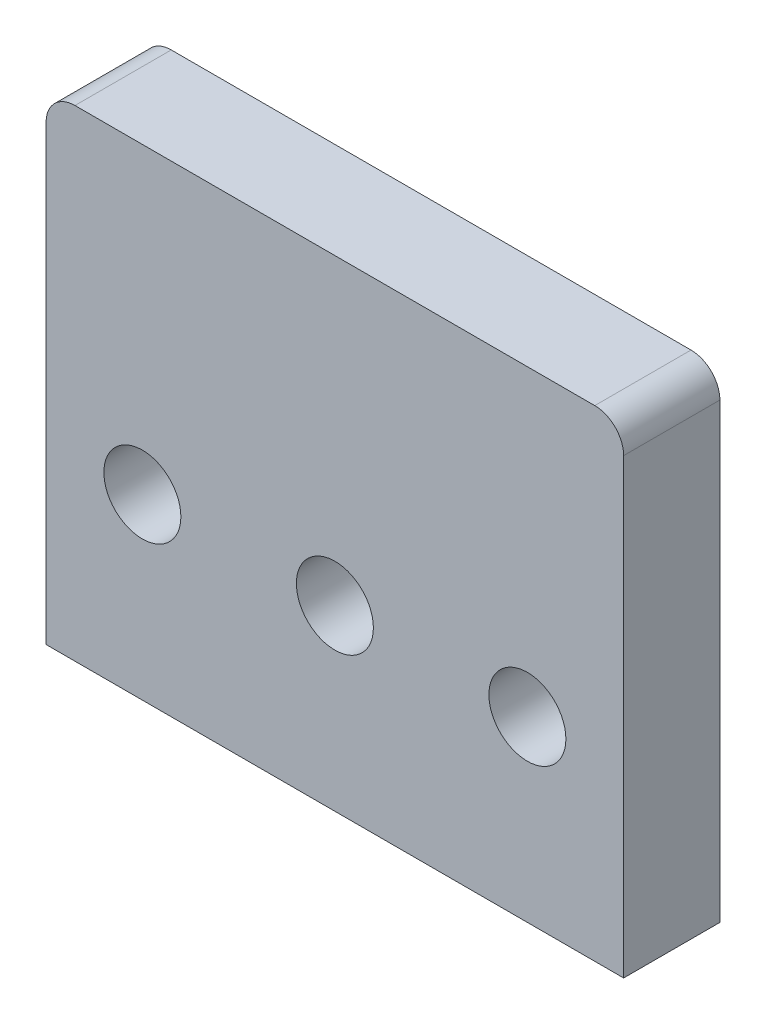
ISO-10303-21;
HEADER;
FILE_DESCRIPTION(('STEP AP214'),'2;1');
FILE_NAME('part.step','',(''),(''),'','','');
FILE_SCHEMA(('AUTOMOTIVE_DESIGN { 1 0 10303 214 1 1 1 1 }'));
ENDSEC;
DATA;
#1=APPLICATION_CONTEXT('core data for automotive mechanical design processes');
#2=APPLICATION_PROTOCOL_DEFINITION('international standard','automotive_design',2000,#1);
#3=PRODUCT_CONTEXT('',#1,'mechanical');
#4=PRODUCT('Part','Part','',(#3));
#5=PRODUCT_RELATED_PRODUCT_CATEGORY('part','',(#4));
#6=PRODUCT_DEFINITION_FORMATION('','',#4);
#7=PRODUCT_DEFINITION_CONTEXT('part definition',#1,'design');
#8=PRODUCT_DEFINITION('design','',#6,#7);
#9=PRODUCT_DEFINITION_SHAPE('','',#8);
#10=(LENGTH_UNIT() NAMED_UNIT(*) SI_UNIT(.MILLI.,.METRE.));
#11=(NAMED_UNIT(*) PLANE_ANGLE_UNIT() SI_UNIT($,.RADIAN.));
#12=(NAMED_UNIT(*) SI_UNIT($,.STERADIAN.) SOLID_ANGLE_UNIT());
#13=UNCERTAINTY_MEASURE_WITH_UNIT(LENGTH_MEASURE(1.E-05),#10,'distance_accuracy_value','');
#14=(GEOMETRIC_REPRESENTATION_CONTEXT(3) GLOBAL_UNCERTAINTY_ASSIGNED_CONTEXT((#13)) GLOBAL_UNIT_ASSIGNED_CONTEXT((#10,
#11,#12)) REPRESENTATION_CONTEXT('',''));
#15=CARTESIAN_POINT('',(0.,0.,0.));
#16=DIRECTION('',(0.,0.,1.));
#17=DIRECTION('',(1.,0.,0.));
#18=AXIS2_PLACEMENT_3D('',#15,#16,#17);
#19=CARTESIAN_POINT('',(-30.,-18.5,10.));
#20=DIRECTION('',(-1.,0.,0.));
#21=DIRECTION('',(0.,0.,1.));
#22=AXIS2_PLACEMENT_3D('',#19,#20,#21);
#23=PLANE('',#22);
#24=DIRECTION('',(0.,1.,0.));
#25=VECTOR('',#24,1.);
#26=CARTESIAN_POINT('',(-30.,-18.5,10.));
#27=LINE('',#26,#25);
#28=CARTESIAN_POINT('',(-30.,-18.5,10.));
#29=VERTEX_POINT('',#28);
#30=CARTESIAN_POINT('',(-30.,28.5,10.));
#31=VERTEX_POINT('',#30);
#32=EDGE_CURVE('E107',#29,#31,#27,.T.);
#33=ORIENTED_EDGE('',*,*,#32,.T.);
#34=DIRECTION('',(0.,0.,-1.));
#35=VECTOR('',#34,1.);
#36=CARTESIAN_POINT('',(-30.,28.5,10.));
#37=LINE('',#36,#35);
#38=CARTESIAN_POINT('',(-30.,28.5,0.));
#39=VERTEX_POINT('',#38);
#40=EDGE_CURVE('E118',#31,#39,#37,.T.);
#41=ORIENTED_EDGE('',*,*,#40,.T.);
#42=DIRECTION('',(0.,1.,0.));
#43=VECTOR('',#42,1.);
#44=CARTESIAN_POINT('',(-30.,-18.5,0.));
#45=LINE('',#44,#43);
#46=CARTESIAN_POINT('',(-30.,-18.5,0.));
#47=VERTEX_POINT('',#46);
#48=EDGE_CURVE('E137',#47,#39,#45,.T.);
#49=ORIENTED_EDGE('',*,*,#48,.F.);
#50=DIRECTION('',(0.,0.,-1.));
#51=VECTOR('',#50,1.);
#52=CARTESIAN_POINT('',(-30.,-18.5,10.));
#53=LINE('',#52,#51);
#54=EDGE_CURVE('E103',#29,#47,#53,.T.);
#55=ORIENTED_EDGE('',*,*,#54,.F.);
#56=EDGE_LOOP('',(#33,#41,#49,#55));
#57=FACE_BOUND('',#56,.T.);
#58=ADVANCED_FACE('F33',(#57),#23,.T.);
#59=CARTESIAN_POINT('',(-30.,-18.5,10.));
#60=DIRECTION('',(0.,1.,0.));
#61=DIRECTION('',(0.,0.,1.));
#62=AXIS2_PLACEMENT_3D('',#59,#60,#61);
#63=PLANE('',#62);
#64=DIRECTION('',(0.,0.,-1.));
#65=VECTOR('',#64,1.);
#66=CARTESIAN_POINT('',(30.,-18.5,10.));
#67=LINE('',#66,#65);
#68=CARTESIAN_POINT('',(30.,-18.5,10.));
#69=VERTEX_POINT('',#68);
#70=CARTESIAN_POINT('',(30.,-18.5,0.));
#71=VERTEX_POINT('',#70);
#72=EDGE_CURVE('E97',#69,#71,#67,.T.);
#73=ORIENTED_EDGE('',*,*,#72,.F.);
#74=DIRECTION('',(1.,0.,0.));
#75=VECTOR('',#74,1.);
#76=CARTESIAN_POINT('',(-30.,-18.5,10.));
#77=LINE('',#76,#75);
#78=EDGE_CURVE('E104',#29,#69,#77,.T.);
#79=ORIENTED_EDGE('',*,*,#78,.F.);
#80=ORIENTED_EDGE('',*,*,#54,.T.);
#81=DIRECTION('',(1.,0.,0.));
#82=VECTOR('',#81,1.);
#83=CARTESIAN_POINT('',(-30.,-18.5,0.));
#84=LINE('',#83,#82);
#85=EDGE_CURVE('E91',#47,#71,#84,.T.);
#86=ORIENTED_EDGE('',*,*,#85,.T.);
#87=EDGE_LOOP('',(#73,#79,#80,#86));
#88=FACE_BOUND('',#87,.T.);
#89=ADVANCED_FACE('F35',(#88),#63,.F.);
#90=CARTESIAN_POINT('',(30.,31.5,10.));
#91=DIRECTION('',(1.,0.,0.));
#92=DIRECTION('',(0.,0.,-1.));
#93=AXIS2_PLACEMENT_3D('',#90,#91,#92);
#94=PLANE('',#93);
#95=DIRECTION('',(0.,-1.,0.));
#96=VECTOR('',#95,1.);
#97=CARTESIAN_POINT('',(30.,31.5,0.));
#98=LINE('',#97,#96);
#99=CARTESIAN_POINT('',(30.,28.5,0.));
#100=VERTEX_POINT('',#99);
#101=EDGE_CURVE('E86',#100,#71,#98,.T.);
#102=ORIENTED_EDGE('',*,*,#101,.F.);
#103=DIRECTION('',(0.,0.,-1.));
#104=VECTOR('',#103,1.);
#105=CARTESIAN_POINT('',(30.,28.5,10.));
#106=LINE('',#105,#104);
#107=CARTESIAN_POINT('',(30.,28.5,10.));
#108=VERTEX_POINT('',#107);
#109=EDGE_CURVE('E11',#100,#108,#106,.F.);
#110=ORIENTED_EDGE('',*,*,#109,.T.);
#111=DIRECTION('',(0.,-1.,0.));
#112=VECTOR('',#111,1.);
#113=CARTESIAN_POINT('',(30.,31.5,10.));
#114=LINE('',#113,#112);
#115=EDGE_CURVE('E99',#108,#69,#114,.T.);
#116=ORIENTED_EDGE('',*,*,#115,.T.);
#117=ORIENTED_EDGE('',*,*,#72,.T.);
#118=EDGE_LOOP('',(#102,#110,#116,#117));
#119=FACE_BOUND('',#118,.T.);
#120=ADVANCED_FACE('F98',(#119),#94,.T.);
#121=CARTESIAN_POINT('',(30.,31.5,10.));
#122=DIRECTION('',(0.,-1.,0.));
#123=DIRECTION('',(1.,0.,0.));
#124=AXIS2_PLACEMENT_3D('',#121,#122,#123);
#125=PLANE('',#124);
#126=DIRECTION('',(-1.,0.,0.));
#127=VECTOR('',#126,1.);
#128=CARTESIAN_POINT('',(30.,31.5,0.));
#129=LINE('',#128,#127);
#130=CARTESIAN_POINT('',(27.,31.5,0.));
#131=VERTEX_POINT('',#130);
#132=CARTESIAN_POINT('',(-27.,31.5,0.));
#133=VERTEX_POINT('',#132);
#134=EDGE_CURVE('E94',#131,#133,#129,.T.);
#135=ORIENTED_EDGE('',*,*,#134,.T.);
#136=DIRECTION('',(0.,0.,-1.));
#137=VECTOR('',#136,1.);
#138=CARTESIAN_POINT('',(-27.,31.5,10.));
#139=LINE('',#138,#137);
#140=CARTESIAN_POINT('',(-27.,31.5,10.));
#141=VERTEX_POINT('',#140);
#142=EDGE_CURVE('E54',#133,#141,#139,.F.);
#143=ORIENTED_EDGE('',*,*,#142,.T.);
#144=DIRECTION('',(-1.,0.,0.));
#145=VECTOR('',#144,1.);
#146=CARTESIAN_POINT('',(30.,31.5,10.));
#147=LINE('',#146,#145);
#148=CARTESIAN_POINT('',(27.,31.5,10.));
#149=VERTEX_POINT('',#148);
#150=EDGE_CURVE('E110',#149,#141,#147,.T.);
#151=ORIENTED_EDGE('',*,*,#150,.F.);
#152=DIRECTION('',(0.,0.,-1.));
#153=VECTOR('',#152,1.);
#154=CARTESIAN_POINT('',(27.,31.5,10.));
#155=LINE('',#154,#153);
#156=EDGE_CURVE('E124',#149,#131,#155,.T.);
#157=ORIENTED_EDGE('',*,*,#156,.T.);
#158=EDGE_LOOP('',(#135,#143,#151,#157));
#159=FACE_BOUND('',#158,.T.);
#160=ADVANCED_FACE('F138',(#159),#125,.F.);
#161=CARTESIAN_POINT('',(-30.,-18.5,10.));
#162=DIRECTION('',(0.,0.,-1.));
#163=DIRECTION('',(-1.,0.,0.));
#164=AXIS2_PLACEMENT_3D('',#161,#162,#163);
#165=PLANE('',#164);
#166=CARTESIAN_POINT('',(20.,0.,10.));
#167=DIRECTION('',(0.,0.,1.));
#168=DIRECTION('',(1.,0.,0.));
#169=AXIS2_PLACEMENT_3D('',#166,#167,#168);
#170=CIRCLE('',#169,4.);
#171=CARTESIAN_POINT('',(24.,0.,10.));
#172=VERTEX_POINT('',#171);
#173=EDGE_CURVE('E157',#172,#172,#170,.T.);
#174=ORIENTED_EDGE('',*,*,#173,.F.);
#175=EDGE_LOOP('',(#174));
#176=FACE_BOUND('',#175,.T.);
#177=CARTESIAN_POINT('',(0.,0.,10.));
#178=DIRECTION('',(0.,0.,1.));
#179=DIRECTION('',(1.,0.,0.));
#180=AXIS2_PLACEMENT_3D('',#177,#178,#179);
#181=CIRCLE('',#180,4.);
#182=CARTESIAN_POINT('',(4.,0.,10.));
#183=VERTEX_POINT('',#182);
#184=EDGE_CURVE('E151',#183,#183,#181,.T.);
#185=ORIENTED_EDGE('',*,*,#184,.F.);
#186=EDGE_LOOP('',(#185));
#187=FACE_BOUND('',#186,.T.);
#188=CARTESIAN_POINT('',(-20.,0.,10.));
#189=DIRECTION('',(0.,0.,1.));
#190=DIRECTION('',(1.,0.,0.));
#191=AXIS2_PLACEMENT_3D('',#188,#189,#190);
#192=CIRCLE('',#191,4.);
#193=CARTESIAN_POINT('',(-16.,0.,10.));
#194=VERTEX_POINT('',#193);
#195=EDGE_CURVE('E145',#194,#194,#192,.T.);
#196=ORIENTED_EDGE('',*,*,#195,.F.);
#197=EDGE_LOOP('',(#196));
#198=FACE_BOUND('',#197,.T.);
#199=ORIENTED_EDGE('',*,*,#150,.T.);
#200=CARTESIAN_POINT('',(-27.,28.5,10.));
#201=DIRECTION('',(0.,0.,-1.));
#202=DIRECTION('',(-1.,0.,0.));
#203=AXIS2_PLACEMENT_3D('',#200,#201,#202);
#204=CIRCLE('',#203,3.);
#205=EDGE_CURVE('E41',#141,#31,#204,.F.);
#206=ORIENTED_EDGE('',*,*,#205,.T.);
#207=ORIENTED_EDGE('',*,*,#32,.F.);
#208=ORIENTED_EDGE('',*,*,#78,.T.);
#209=ORIENTED_EDGE('',*,*,#115,.F.);
#210=CARTESIAN_POINT('',(27.,28.5,10.));
#211=DIRECTION('',(0.,0.,-1.));
#212=DIRECTION('',(-1.,0.,0.));
#213=AXIS2_PLACEMENT_3D('',#210,#211,#212);
#214=CIRCLE('',#213,3.);
#215=EDGE_CURVE('E128',#108,#149,#214,.F.);
#216=ORIENTED_EDGE('',*,*,#215,.T.);
#217=EDGE_LOOP('',(#199,#206,#207,#208,#209,#216));
#218=FACE_BOUND('',#217,.T.);
#219=ADVANCED_FACE('F132',(#176,#187,#198,#218),#165,.F.);
#220=CARTESIAN_POINT('',(-30.,-18.5,0.));
#221=DIRECTION('',(0.,0.,-1.));
#222=DIRECTION('',(-1.,0.,0.));
#223=AXIS2_PLACEMENT_3D('',#220,#221,#222);
#224=PLANE('',#223);
#225=CARTESIAN_POINT('',(20.,0.,0.));
#226=DIRECTION('',(0.,0.,1.));
#227=DIRECTION('',(1.,0.,0.));
#228=AXIS2_PLACEMENT_3D('',#225,#226,#227);
#229=CIRCLE('',#228,4.);
#230=CARTESIAN_POINT('',(24.,0.,0.));
#231=VERTEX_POINT('',#230);
#232=EDGE_CURVE('E154',#231,#231,#229,.T.);
#233=ORIENTED_EDGE('',*,*,#232,.T.);
#234=EDGE_LOOP('',(#233));
#235=FACE_BOUND('',#234,.T.);
#236=CARTESIAN_POINT('',(0.,0.,0.));
#237=DIRECTION('',(0.,0.,1.));
#238=DIRECTION('',(1.,0.,0.));
#239=AXIS2_PLACEMENT_3D('',#236,#237,#238);
#240=CIRCLE('',#239,4.);
#241=CARTESIAN_POINT('',(4.,0.,0.));
#242=VERTEX_POINT('',#241);
#243=EDGE_CURVE('E148',#242,#242,#240,.T.);
#244=ORIENTED_EDGE('',*,*,#243,.T.);
#245=EDGE_LOOP('',(#244));
#246=FACE_BOUND('',#245,.T.);
#247=CARTESIAN_POINT('',(-20.,0.,0.));
#248=DIRECTION('',(0.,0.,1.));
#249=DIRECTION('',(1.,0.,0.));
#250=AXIS2_PLACEMENT_3D('',#247,#248,#249);
#251=CIRCLE('',#250,4.);
#252=CARTESIAN_POINT('',(-16.,0.,0.));
#253=VERTEX_POINT('',#252);
#254=EDGE_CURVE('E140',#253,#253,#251,.T.);
#255=ORIENTED_EDGE('',*,*,#254,.T.);
#256=EDGE_LOOP('',(#255));
#257=FACE_BOUND('',#256,.T.);
#258=ORIENTED_EDGE('',*,*,#48,.T.);
#259=CARTESIAN_POINT('',(-27.,28.5,0.));
#260=DIRECTION('',(0.,0.,-1.));
#261=DIRECTION('',(-1.,0.,0.));
#262=AXIS2_PLACEMENT_3D('',#259,#260,#261);
#263=CIRCLE('',#262,3.);
#264=EDGE_CURVE('E122',#39,#133,#263,.T.);
#265=ORIENTED_EDGE('',*,*,#264,.T.);
#266=ORIENTED_EDGE('',*,*,#134,.F.);
#267=CARTESIAN_POINT('',(27.,28.5,0.));
#268=DIRECTION('',(0.,0.,-1.));
#269=DIRECTION('',(-1.,0.,0.));
#270=AXIS2_PLACEMENT_3D('',#267,#268,#269);
#271=CIRCLE('',#270,3.);
#272=EDGE_CURVE('E93',#131,#100,#271,.T.);
#273=ORIENTED_EDGE('',*,*,#272,.T.);
#274=ORIENTED_EDGE('',*,*,#101,.T.);
#275=ORIENTED_EDGE('',*,*,#85,.F.);
#276=EDGE_LOOP('',(#258,#265,#266,#273,#274,#275));
#277=FACE_BOUND('',#276,.T.);
#278=ADVANCED_FACE('F89',(#235,#246,#257,#277),#224,.T.);
#279=CARTESIAN_POINT('',(-27.,28.5,10.));
#280=DIRECTION('',(0.,0.,1.));
#281=DIRECTION('',(1.,0.,0.));
#282=AXIS2_PLACEMENT_3D('',#279,#280,#281);
#283=CYLINDRICAL_SURFACE('',#282,3.);
#284=ORIENTED_EDGE('',*,*,#205,.F.);
#285=ORIENTED_EDGE('',*,*,#142,.F.);
#286=ORIENTED_EDGE('',*,*,#264,.F.);
#287=ORIENTED_EDGE('',*,*,#40,.F.);
#288=EDGE_LOOP('',(#284,#285,#286,#287));
#289=FACE_BOUND('',#288,.T.);
#290=ADVANCED_FACE('F136',(#289),#283,.T.);
#291=CARTESIAN_POINT('',(27.,28.5,10.));
#292=DIRECTION('',(0.,0.,1.));
#293=DIRECTION('',(1.,0.,0.));
#294=AXIS2_PLACEMENT_3D('',#291,#292,#293);
#295=CYLINDRICAL_SURFACE('',#294,3.);
#296=ORIENTED_EDGE('',*,*,#215,.F.);
#297=ORIENTED_EDGE('',*,*,#109,.F.);
#298=ORIENTED_EDGE('',*,*,#272,.F.);
#299=ORIENTED_EDGE('',*,*,#156,.F.);
#300=EDGE_LOOP('',(#296,#297,#298,#299));
#301=FACE_BOUND('',#300,.T.);
#302=ADVANCED_FACE('F173',(#301),#295,.T.);
#303=CARTESIAN_POINT('',(-20.,0.,0.));
#304=DIRECTION('',(0.,0.,1.));
#305=DIRECTION('',(1.,0.,0.));
#306=AXIS2_PLACEMENT_3D('',#303,#304,#305);
#307=CYLINDRICAL_SURFACE('',#306,4.);
#308=ORIENTED_EDGE('',*,*,#254,.F.);
#309=EDGE_LOOP('',(#308));
#310=FACE_BOUND('',#309,.T.);
#311=ORIENTED_EDGE('',*,*,#195,.T.);
#312=EDGE_LOOP('',(#311));
#313=FACE_BOUND('',#312,.T.);
#314=ADVANCED_FACE('F170',(#310,#313),#307,.F.);
#315=CARTESIAN_POINT('',(0.,0.,0.));
#316=DIRECTION('',(0.,0.,1.));
#317=DIRECTION('',(1.,0.,0.));
#318=AXIS2_PLACEMENT_3D('',#315,#316,#317);
#319=CYLINDRICAL_SURFACE('',#318,4.);
#320=ORIENTED_EDGE('',*,*,#243,.F.);
#321=EDGE_LOOP('',(#320));
#322=FACE_BOUND('',#321,.T.);
#323=ORIENTED_EDGE('',*,*,#184,.T.);
#324=EDGE_LOOP('',(#323));
#325=FACE_BOUND('',#324,.T.);
#326=ADVANCED_FACE('F172',(#322,#325),#319,.F.);
#327=CARTESIAN_POINT('',(20.,0.,0.));
#328=DIRECTION('',(0.,0.,1.));
#329=DIRECTION('',(1.,0.,0.));
#330=AXIS2_PLACEMENT_3D('',#327,#328,#329);
#331=CYLINDRICAL_SURFACE('',#330,4.);
#332=ORIENTED_EDGE('',*,*,#232,.F.);
#333=EDGE_LOOP('',(#332));
#334=FACE_BOUND('',#333,.T.);
#335=ORIENTED_EDGE('',*,*,#173,.T.);
#336=EDGE_LOOP('',(#335));
#337=FACE_BOUND('',#336,.T.);
#338=ADVANCED_FACE('F161',(#334,#337),#331,.F.);
#339=CLOSED_SHELL('',(#58,#89,#120,#160,#219,#278,#290,#302,#314,#326,#338));
#340=MANIFOLD_SOLID_BREP('B2',#339);
#341=ADVANCED_BREP_SHAPE_REPRESENTATION('',(#18,#340),#14);
#342=SHAPE_DEFINITION_REPRESENTATION(#9,#341);
ENDSEC;
END-ISO-10303-21;
